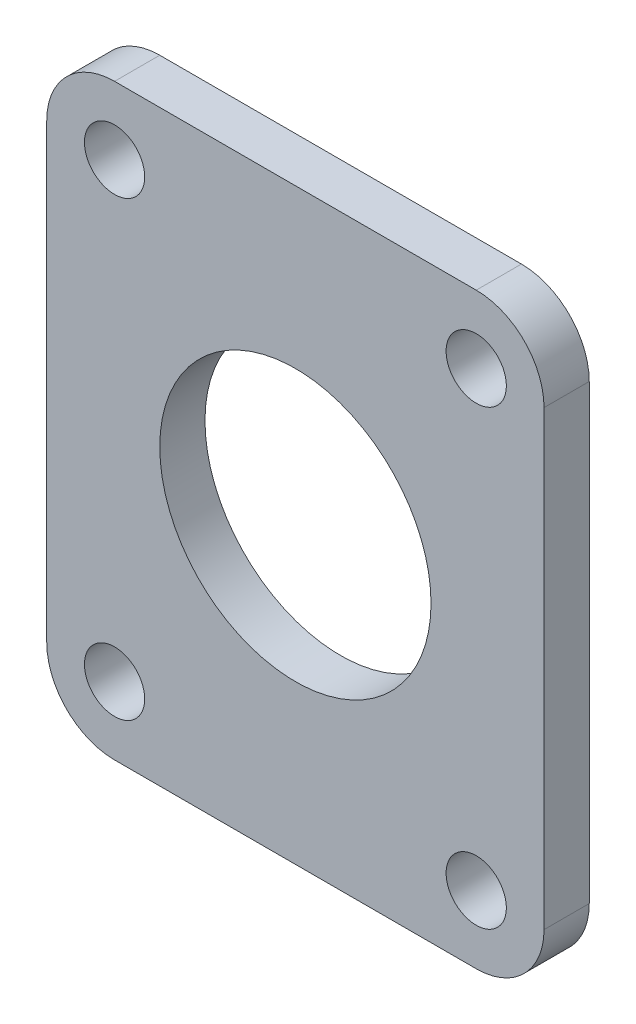
ISO-10303-21;
HEADER;
FILE_DESCRIPTION(('STEP AP214'),'2;1');
FILE_NAME('part.step','',(''),(''),'','','');
FILE_SCHEMA(('AUTOMOTIVE_DESIGN { 1 0 10303 214 1 1 1 1 }'));
ENDSEC;
DATA;
#1=APPLICATION_CONTEXT('core data for automotive mechanical design processes');
#2=APPLICATION_PROTOCOL_DEFINITION('international standard','automotive_design',2000,#1);
#3=PRODUCT_CONTEXT('',#1,'mechanical');
#4=PRODUCT('Part','Part','',(#3));
#5=PRODUCT_RELATED_PRODUCT_CATEGORY('part','',(#4));
#6=PRODUCT_DEFINITION_FORMATION('','',#4);
#7=PRODUCT_DEFINITION_CONTEXT('part definition',#1,'design');
#8=PRODUCT_DEFINITION('design','',#6,#7);
#9=PRODUCT_DEFINITION_SHAPE('','',#8);
#10=(LENGTH_UNIT() NAMED_UNIT(*) SI_UNIT(.MILLI.,.METRE.));
#11=(NAMED_UNIT(*) PLANE_ANGLE_UNIT() SI_UNIT($,.RADIAN.));
#12=(NAMED_UNIT(*) SI_UNIT($,.STERADIAN.) SOLID_ANGLE_UNIT());
#13=UNCERTAINTY_MEASURE_WITH_UNIT(LENGTH_MEASURE(1.E-05),#10,'distance_accuracy_value','');
#14=(GEOMETRIC_REPRESENTATION_CONTEXT(3) GLOBAL_UNCERTAINTY_ASSIGNED_CONTEXT((#13)) GLOBAL_UNIT_ASSIGNED_CONTEXT((#10,
#11,#12)) REPRESENTATION_CONTEXT('',''));
#15=CARTESIAN_POINT('',(0.,0.,0.));
#16=DIRECTION('',(0.,0.,1.));
#17=DIRECTION('',(1.,0.,0.));
#18=AXIS2_PLACEMENT_3D('',#15,#16,#17);
#19=CARTESIAN_POINT('',(653.3709893686,460.456018304,3.));
#20=DIRECTION('',(0.,0.,1.));
#21=DIRECTION('',(1.,0.,0.));
#22=AXIS2_PLACEMENT_3D('',#19,#20,#21);
#23=PLANE('',#22);
#24=CARTESIAN_POINT('',(653.3709893686,430.456018304,3.));
#25=DIRECTION('',(0.,0.,1.));
#26=DIRECTION('',(1.,0.,0.));
#27=AXIS2_PLACEMENT_3D('',#24,#25,#26);
#28=CIRCLE('',#27,2.);
#29=CARTESIAN_POINT('',(655.3709893686,430.456018304,3.));
#30=VERTEX_POINT('',#29);
#31=EDGE_CURVE('E194',#30,#30,#28,.T.);
#32=ORIENTED_EDGE('',*,*,#31,.F.);
#33=EDGE_LOOP('',(#32));
#34=FACE_BOUND('',#33,.T.);
#35=CARTESIAN_POINT('',(677.3709893686,460.456018304,3.));
#36=DIRECTION('',(0.,0.,1.));
#37=DIRECTION('',(1.,0.,0.));
#38=AXIS2_PLACEMENT_3D('',#35,#36,#37);
#39=CIRCLE('',#38,2.);
#40=CARTESIAN_POINT('',(679.3709893686,460.456018304,3.));
#41=VERTEX_POINT('',#40);
#42=EDGE_CURVE('E182',#41,#41,#39,.T.);
#43=ORIENTED_EDGE('',*,*,#42,.F.);
#44=EDGE_LOOP('',(#43));
#45=FACE_BOUND('',#44,.T.);
#46=CARTESIAN_POINT('',(653.3709893686,460.456018304,3.));
#47=DIRECTION('',(0.,0.,1.));
#48=DIRECTION('',(1.,0.,0.));
#49=AXIS2_PLACEMENT_3D('',#46,#47,#48);
#50=CIRCLE('',#49,4.50000000000003);
#51=CARTESIAN_POINT('',(653.3709893686,464.956018304,3.));
#52=VERTEX_POINT('',#51);
#53=CARTESIAN_POINT('',(648.8709893686,460.456018304,3.));
#54=VERTEX_POINT('',#53);
#55=EDGE_CURVE('E145',#52,#54,#50,.T.);
#56=ORIENTED_EDGE('',*,*,#55,.T.);
#57=DIRECTION('',(0.,-1.,0.));
#58=VECTOR('',#57,1.);
#59=CARTESIAN_POINT('',(648.8709893686,460.456018304,3.));
#60=LINE('',#59,#58);
#61=CARTESIAN_POINT('',(648.8709893686,430.456018304,3.));
#62=VERTEX_POINT('',#61);
#63=EDGE_CURVE('E93',#54,#62,#60,.T.);
#64=ORIENTED_EDGE('',*,*,#63,.T.);
#65=CARTESIAN_POINT('',(653.3709893686,430.456018304,3.));
#66=DIRECTION('',(0.,0.,1.));
#67=DIRECTION('',(1.,0.,0.));
#68=AXIS2_PLACEMENT_3D('',#65,#66,#67);
#69=CIRCLE('',#68,4.50000000000003);
#70=CARTESIAN_POINT('',(653.3709893686,425.956018304,3.));
#71=VERTEX_POINT('',#70);
#72=EDGE_CURVE('E160',#62,#71,#69,.T.);
#73=ORIENTED_EDGE('',*,*,#72,.T.);
#74=DIRECTION('',(1.,0.,0.));
#75=VECTOR('',#74,1.);
#76=CARTESIAN_POINT('',(653.3709893686,425.956018304,3.));
#77=LINE('',#76,#75);
#78=CARTESIAN_POINT('',(677.3709893686,425.956018304,3.));
#79=VERTEX_POINT('',#78);
#80=EDGE_CURVE('E173',#71,#79,#77,.T.);
#81=ORIENTED_EDGE('',*,*,#80,.T.);
#82=CARTESIAN_POINT('',(677.3709893686,430.456018304,3.));
#83=DIRECTION('',(0.,0.,1.));
#84=DIRECTION('',(1.,0.,0.));
#85=AXIS2_PLACEMENT_3D('',#82,#83,#84);
#86=CIRCLE('',#85,4.49999999999998);
#87=CARTESIAN_POINT('',(681.8709893686,430.456018304,3.));
#88=VERTEX_POINT('',#87);
#89=EDGE_CURVE('E112',#79,#88,#86,.T.);
#90=ORIENTED_EDGE('',*,*,#89,.T.);
#91=DIRECTION('',(0.,1.,0.));
#92=VECTOR('',#91,1.);
#93=CARTESIAN_POINT('',(681.8709893686,430.456018304,3.));
#94=LINE('',#93,#92);
#95=CARTESIAN_POINT('',(681.8709893686,460.456018304,3.));
#96=VERTEX_POINT('',#95);
#97=EDGE_CURVE('E106',#88,#96,#94,.T.);
#98=ORIENTED_EDGE('',*,*,#97,.T.);
#99=CARTESIAN_POINT('',(677.3709893686,460.456018304,3.));
#100=DIRECTION('',(0.,0.,1.));
#101=DIRECTION('',(1.,0.,0.));
#102=AXIS2_PLACEMENT_3D('',#99,#100,#101);
#103=CIRCLE('',#102,4.49999999999998);
#104=CARTESIAN_POINT('',(677.3709893686,464.956018304,3.));
#105=VERTEX_POINT('',#104);
#106=EDGE_CURVE('E110',#96,#105,#103,.T.);
#107=ORIENTED_EDGE('',*,*,#106,.T.);
#108=DIRECTION('',(-1.,0.,0.));
#109=VECTOR('',#108,1.);
#110=CARTESIAN_POINT('',(677.3709893686,464.956018304,3.));
#111=LINE('',#110,#109);
#112=EDGE_CURVE('E50',#105,#52,#111,.T.);
#113=ORIENTED_EDGE('',*,*,#112,.T.);
#114=EDGE_LOOP('',(#56,#64,#73,#81,#90,#98,#107,#113));
#115=FACE_BOUND('',#114,.T.);
#116=CARTESIAN_POINT('',(677.3709893686,430.456018304,3.));
#117=DIRECTION('',(0.,0.,1.));
#118=DIRECTION('',(1.,0.,0.));
#119=AXIS2_PLACEMENT_3D('',#116,#117,#118);
#120=CIRCLE('',#119,2.);
#121=CARTESIAN_POINT('',(679.3709893686,430.456018304,3.));
#122=VERTEX_POINT('',#121);
#123=EDGE_CURVE('E134',#122,#122,#120,.T.);
#124=ORIENTED_EDGE('',*,*,#123,.F.);
#125=EDGE_LOOP('',(#124));
#126=FACE_BOUND('',#125,.T.);
#127=CARTESIAN_POINT('',(653.3709893686,460.456018304,3.));
#128=DIRECTION('',(0.,0.,1.));
#129=DIRECTION('',(1.,0.,0.));
#130=AXIS2_PLACEMENT_3D('',#127,#128,#129);
#131=CIRCLE('',#130,2.);
#132=CARTESIAN_POINT('',(655.3709893686,460.456018304,3.));
#133=VERTEX_POINT('',#132);
#134=EDGE_CURVE('E188',#133,#133,#131,.T.);
#135=ORIENTED_EDGE('',*,*,#134,.F.);
#136=EDGE_LOOP('',(#135));
#137=FACE_BOUND('',#136,.T.);
#138=CARTESIAN_POINT('',(665.3709893686,445.456018304,3.));
#139=DIRECTION('',(0.,0.,1.));
#140=DIRECTION('',(1.,0.,0.));
#141=AXIS2_PLACEMENT_3D('',#138,#139,#140);
#142=CIRCLE('',#141,9.00000000000001);
#143=CARTESIAN_POINT('',(674.3709893686,445.456018304,3.));
#144=VERTEX_POINT('',#143);
#145=EDGE_CURVE('E200',#144,#144,#142,.T.);
#146=ORIENTED_EDGE('',*,*,#145,.F.);
#147=EDGE_LOOP('',(#146));
#148=FACE_BOUND('',#147,.T.);
#149=ADVANCED_FACE('F33',(#34,#45,#115,#126,#137,#148),#23,.T.);
#150=CARTESIAN_POINT('',(653.3709893686,460.456018304,0.));
#151=DIRECTION('',(0.,0.,1.));
#152=DIRECTION('',(1.,0.,0.));
#153=AXIS2_PLACEMENT_3D('',#150,#151,#152);
#154=PLANE('',#153);
#155=CARTESIAN_POINT('',(653.3709893686,430.456018304,0.));
#156=DIRECTION('',(0.,0.,1.));
#157=DIRECTION('',(1.,0.,0.));
#158=AXIS2_PLACEMENT_3D('',#155,#156,#157);
#159=CIRCLE('',#158,2.);
#160=CARTESIAN_POINT('',(655.3709893686,430.456018304,0.));
#161=VERTEX_POINT('',#160);
#162=EDGE_CURVE('E197',#161,#161,#159,.T.);
#163=ORIENTED_EDGE('',*,*,#162,.T.);
#164=EDGE_LOOP('',(#163));
#165=FACE_BOUND('',#164,.T.);
#166=CARTESIAN_POINT('',(677.3709893686,460.456018304,0.));
#167=DIRECTION('',(0.,0.,1.));
#168=DIRECTION('',(1.,0.,0.));
#169=AXIS2_PLACEMENT_3D('',#166,#167,#168);
#170=CIRCLE('',#169,2.);
#171=CARTESIAN_POINT('',(679.3709893686,460.456018304,0.));
#172=VERTEX_POINT('',#171);
#173=EDGE_CURVE('E185',#172,#172,#170,.T.);
#174=ORIENTED_EDGE('',*,*,#173,.T.);
#175=EDGE_LOOP('',(#174));
#176=FACE_BOUND('',#175,.T.);
#177=CARTESIAN_POINT('',(653.3709893686,460.456018304,0.));
#178=DIRECTION('',(0.,0.,1.));
#179=DIRECTION('',(1.,0.,0.));
#180=AXIS2_PLACEMENT_3D('',#177,#178,#179);
#181=CIRCLE('',#180,4.50000000000003);
#182=CARTESIAN_POINT('',(653.3709893686,464.956018304,0.));
#183=VERTEX_POINT('',#182);
#184=CARTESIAN_POINT('',(648.8709893686,460.456018304,0.));
#185=VERTEX_POINT('',#184);
#186=EDGE_CURVE('E130',#183,#185,#181,.T.);
#187=ORIENTED_EDGE('',*,*,#186,.F.);
#188=DIRECTION('',(-1.,0.,0.));
#189=VECTOR('',#188,1.);
#190=CARTESIAN_POINT('',(677.3709893686,464.956018304,0.));
#191=LINE('',#190,#189);
#192=CARTESIAN_POINT('',(677.3709893686,464.956018304,0.));
#193=VERTEX_POINT('',#192);
#194=EDGE_CURVE('E85',#193,#183,#191,.T.);
#195=ORIENTED_EDGE('',*,*,#194,.F.);
#196=CARTESIAN_POINT('',(677.3709893686,460.456018304,0.));
#197=DIRECTION('',(0.,0.,1.));
#198=DIRECTION('',(1.,0.,0.));
#199=AXIS2_PLACEMENT_3D('',#196,#197,#198);
#200=CIRCLE('',#199,4.49999999999998);
#201=CARTESIAN_POINT('',(681.8709893686,460.456018304,0.));
#202=VERTEX_POINT('',#201);
#203=EDGE_CURVE('E79',#202,#193,#200,.T.);
#204=ORIENTED_EDGE('',*,*,#203,.F.);
#205=DIRECTION('',(0.,1.,0.));
#206=VECTOR('',#205,1.);
#207=CARTESIAN_POINT('',(681.8709893686,430.456018304,0.));
#208=LINE('',#207,#206);
#209=CARTESIAN_POINT('',(681.8709893686,430.456018304,0.));
#210=VERTEX_POINT('',#209);
#211=EDGE_CURVE('E120',#210,#202,#208,.T.);
#212=ORIENTED_EDGE('',*,*,#211,.F.);
#213=CARTESIAN_POINT('',(677.3709893686,430.456018304,0.));
#214=DIRECTION('',(0.,0.,1.));
#215=DIRECTION('',(1.,0.,0.));
#216=AXIS2_PLACEMENT_3D('',#213,#214,#215);
#217=CIRCLE('',#216,4.49999999999998);
#218=CARTESIAN_POINT('',(677.3709893686,425.956018304,0.));
#219=VERTEX_POINT('',#218);
#220=EDGE_CURVE('E140',#219,#210,#217,.T.);
#221=ORIENTED_EDGE('',*,*,#220,.F.);
#222=DIRECTION('',(1.,0.,0.));
#223=VECTOR('',#222,1.);
#224=CARTESIAN_POINT('',(653.3709893686,425.956018304,0.));
#225=LINE('',#224,#223);
#226=CARTESIAN_POINT('',(653.3709893686,425.956018304,0.));
#227=VERTEX_POINT('',#226);
#228=EDGE_CURVE('E138',#227,#219,#225,.T.);
#229=ORIENTED_EDGE('',*,*,#228,.F.);
#230=CARTESIAN_POINT('',(653.3709893686,430.456018304,0.));
#231=DIRECTION('',(0.,0.,1.));
#232=DIRECTION('',(1.,0.,0.));
#233=AXIS2_PLACEMENT_3D('',#230,#231,#232);
#234=CIRCLE('',#233,4.50000000000003);
#235=CARTESIAN_POINT('',(648.8709893686,430.456018304,0.));
#236=VERTEX_POINT('',#235);
#237=EDGE_CURVE('E136',#236,#227,#234,.T.);
#238=ORIENTED_EDGE('',*,*,#237,.F.);
#239=DIRECTION('',(0.,-1.,0.));
#240=VECTOR('',#239,1.);
#241=CARTESIAN_POINT('',(648.8709893686,460.456018304,0.));
#242=LINE('',#241,#240);
#243=EDGE_CURVE('E133',#185,#236,#242,.T.);
#244=ORIENTED_EDGE('',*,*,#243,.F.);
#245=EDGE_LOOP('',(#187,#195,#204,#212,#221,#229,#238,#244));
#246=FACE_BOUND('',#245,.T.);
#247=CARTESIAN_POINT('',(677.3709893686,430.456018304,0.));
#248=DIRECTION('',(0.,0.,1.));
#249=DIRECTION('',(1.,0.,0.));
#250=AXIS2_PLACEMENT_3D('',#247,#248,#249);
#251=CIRCLE('',#250,2.);
#252=CARTESIAN_POINT('',(679.3709893686,430.456018304,0.));
#253=VERTEX_POINT('',#252);
#254=EDGE_CURVE('E179',#253,#253,#251,.T.);
#255=ORIENTED_EDGE('',*,*,#254,.T.);
#256=EDGE_LOOP('',(#255));
#257=FACE_BOUND('',#256,.T.);
#258=CARTESIAN_POINT('',(653.3709893686,460.456018304,0.));
#259=DIRECTION('',(0.,0.,1.));
#260=DIRECTION('',(1.,0.,0.));
#261=AXIS2_PLACEMENT_3D('',#258,#259,#260);
#262=CIRCLE('',#261,2.);
#263=CARTESIAN_POINT('',(655.3709893686,460.456018304,0.));
#264=VERTEX_POINT('',#263);
#265=EDGE_CURVE('E191',#264,#264,#262,.T.);
#266=ORIENTED_EDGE('',*,*,#265,.T.);
#267=EDGE_LOOP('',(#266));
#268=FACE_BOUND('',#267,.T.);
#269=CARTESIAN_POINT('',(665.3709893686,445.456018304,0.));
#270=DIRECTION('',(0.,0.,1.));
#271=DIRECTION('',(1.,0.,0.));
#272=AXIS2_PLACEMENT_3D('',#269,#270,#271);
#273=CIRCLE('',#272,9.00000000000001);
#274=CARTESIAN_POINT('',(674.3709893686,445.456018304,0.));
#275=VERTEX_POINT('',#274);
#276=EDGE_CURVE('E203',#275,#275,#273,.T.);
#277=ORIENTED_EDGE('',*,*,#276,.T.);
#278=EDGE_LOOP('',(#277));
#279=FACE_BOUND('',#278,.T.);
#280=ADVANCED_FACE('F164',(#165,#176,#246,#257,#268,#279),#154,.F.);
#281=CARTESIAN_POINT('',(653.3709893686,460.456018304,3.));
#282=DIRECTION('',(0.,0.,-1.));
#283=DIRECTION('',(-1.,0.,0.));
#284=AXIS2_PLACEMENT_3D('',#281,#282,#283);
#285=CYLINDRICAL_SURFACE('',#284,4.50000000000003);
#286=ORIENTED_EDGE('',*,*,#186,.T.);
#287=DIRECTION('',(0.,0.,-1.));
#288=VECTOR('',#287,1.);
#289=CARTESIAN_POINT('',(648.8709893686,460.456018304,3.));
#290=LINE('',#289,#288);
#291=EDGE_CURVE('E11',#54,#185,#290,.T.);
#292=ORIENTED_EDGE('',*,*,#291,.F.);
#293=ORIENTED_EDGE('',*,*,#55,.F.);
#294=DIRECTION('',(0.,0.,-1.));
#295=VECTOR('',#294,1.);
#296=CARTESIAN_POINT('',(653.3709893686,464.956018304,3.));
#297=LINE('',#296,#295);
#298=EDGE_CURVE('E126',#52,#183,#297,.T.);
#299=ORIENTED_EDGE('',*,*,#298,.T.);
#300=EDGE_LOOP('',(#286,#292,#293,#299));
#301=FACE_BOUND('',#300,.T.);
#302=ADVANCED_FACE('F35',(#301),#285,.T.);
#303=CARTESIAN_POINT('',(648.8709893686,460.456018304,3.));
#304=DIRECTION('',(1.,0.,0.));
#305=DIRECTION('',(0.,0.,-1.));
#306=AXIS2_PLACEMENT_3D('',#303,#304,#305);
#307=PLANE('',#306);
#308=ORIENTED_EDGE('',*,*,#243,.T.);
#309=DIRECTION('',(0.,0.,-1.));
#310=VECTOR('',#309,1.);
#311=CARTESIAN_POINT('',(648.8709893686,430.456018304,3.));
#312=LINE('',#311,#310);
#313=EDGE_CURVE('E42',#62,#236,#312,.T.);
#314=ORIENTED_EDGE('',*,*,#313,.F.);
#315=ORIENTED_EDGE('',*,*,#63,.F.);
#316=ORIENTED_EDGE('',*,*,#291,.T.);
#317=EDGE_LOOP('',(#308,#314,#315,#316));
#318=FACE_BOUND('',#317,.T.);
#319=ADVANCED_FACE('F238',(#318),#307,.F.);
#320=CARTESIAN_POINT('',(653.3709893686,430.456018304,3.));
#321=DIRECTION('',(0.,0.,-1.));
#322=DIRECTION('',(-1.,0.,0.));
#323=AXIS2_PLACEMENT_3D('',#320,#321,#322);
#324=CYLINDRICAL_SURFACE('',#323,4.50000000000003);
#325=ORIENTED_EDGE('',*,*,#237,.T.);
#326=DIRECTION('',(0.,0.,-1.));
#327=VECTOR('',#326,1.);
#328=CARTESIAN_POINT('',(653.3709893686,425.956018304,3.));
#329=LINE('',#328,#327);
#330=EDGE_CURVE('E152',#71,#227,#329,.T.);
#331=ORIENTED_EDGE('',*,*,#330,.F.);
#332=ORIENTED_EDGE('',*,*,#72,.F.);
#333=ORIENTED_EDGE('',*,*,#313,.T.);
#334=EDGE_LOOP('',(#325,#331,#332,#333));
#335=FACE_BOUND('',#334,.T.);
#336=ADVANCED_FACE('F158',(#335),#324,.T.);
#337=CARTESIAN_POINT('',(653.3709893686,425.956018304,3.));
#338=DIRECTION('',(0.,1.,0.));
#339=DIRECTION('',(0.,0.,1.));
#340=AXIS2_PLACEMENT_3D('',#337,#338,#339);
#341=PLANE('',#340);
#342=ORIENTED_EDGE('',*,*,#228,.T.);
#343=DIRECTION('',(0.,0.,-1.));
#344=VECTOR('',#343,1.);
#345=CARTESIAN_POINT('',(677.3709893686,425.956018304,3.));
#346=LINE('',#345,#344);
#347=EDGE_CURVE('E149',#79,#219,#346,.T.);
#348=ORIENTED_EDGE('',*,*,#347,.F.);
#349=ORIENTED_EDGE('',*,*,#80,.F.);
#350=ORIENTED_EDGE('',*,*,#330,.T.);
#351=EDGE_LOOP('',(#342,#348,#349,#350));
#352=FACE_BOUND('',#351,.T.);
#353=ADVANCED_FACE('F169',(#352),#341,.F.);
#354=CARTESIAN_POINT('',(677.3709893686,430.456018304,3.));
#355=DIRECTION('',(0.,0.,-1.));
#356=DIRECTION('',(-1.,0.,0.));
#357=AXIS2_PLACEMENT_3D('',#354,#355,#356);
#358=CYLINDRICAL_SURFACE('',#357,4.49999999999998);
#359=ORIENTED_EDGE('',*,*,#220,.T.);
#360=DIRECTION('',(0.,0.,-1.));
#361=VECTOR('',#360,1.);
#362=CARTESIAN_POINT('',(681.8709893686,430.456018304,3.));
#363=LINE('',#362,#361);
#364=EDGE_CURVE('E121',#88,#210,#363,.T.);
#365=ORIENTED_EDGE('',*,*,#364,.F.);
#366=ORIENTED_EDGE('',*,*,#89,.F.);
#367=ORIENTED_EDGE('',*,*,#347,.T.);
#368=EDGE_LOOP('',(#359,#365,#366,#367));
#369=FACE_BOUND('',#368,.T.);
#370=ADVANCED_FACE('F172',(#369),#358,.T.);
#371=CARTESIAN_POINT('',(681.8709893686,430.456018304,3.));
#372=DIRECTION('',(-1.,0.,0.));
#373=DIRECTION('',(0.,0.,1.));
#374=AXIS2_PLACEMENT_3D('',#371,#372,#373);
#375=PLANE('',#374);
#376=ORIENTED_EDGE('',*,*,#211,.T.);
#377=DIRECTION('',(0.,0.,-1.));
#378=VECTOR('',#377,1.);
#379=CARTESIAN_POINT('',(681.8709893686,460.456018304,3.));
#380=LINE('',#379,#378);
#381=EDGE_CURVE('E117',#96,#202,#380,.T.);
#382=ORIENTED_EDGE('',*,*,#381,.F.);
#383=ORIENTED_EDGE('',*,*,#97,.F.);
#384=ORIENTED_EDGE('',*,*,#364,.T.);
#385=EDGE_LOOP('',(#376,#382,#383,#384));
#386=FACE_BOUND('',#385,.T.);
#387=ADVANCED_FACE('F118',(#386),#375,.F.);
#388=CARTESIAN_POINT('',(677.3709893686,460.456018304,3.));
#389=DIRECTION('',(0.,0.,-1.));
#390=DIRECTION('',(-1.,0.,0.));
#391=AXIS2_PLACEMENT_3D('',#388,#389,#390);
#392=CYLINDRICAL_SURFACE('',#391,4.49999999999998);
#393=ORIENTED_EDGE('',*,*,#203,.T.);
#394=DIRECTION('',(0.,0.,-1.));
#395=VECTOR('',#394,1.);
#396=CARTESIAN_POINT('',(677.3709893686,464.956018304,3.));
#397=LINE('',#396,#395);
#398=EDGE_CURVE('E122',#105,#193,#397,.T.);
#399=ORIENTED_EDGE('',*,*,#398,.F.);
#400=ORIENTED_EDGE('',*,*,#106,.F.);
#401=ORIENTED_EDGE('',*,*,#381,.T.);
#402=EDGE_LOOP('',(#393,#399,#400,#401));
#403=FACE_BOUND('',#402,.T.);
#404=ADVANCED_FACE('F124',(#403),#392,.T.);
#405=CARTESIAN_POINT('',(677.3709893686,464.956018304,3.));
#406=DIRECTION('',(0.,-1.,0.));
#407=DIRECTION('',(0.,0.,-1.));
#408=AXIS2_PLACEMENT_3D('',#405,#406,#407);
#409=PLANE('',#408);
#410=ORIENTED_EDGE('',*,*,#194,.T.);
#411=ORIENTED_EDGE('',*,*,#298,.F.);
#412=ORIENTED_EDGE('',*,*,#112,.F.);
#413=ORIENTED_EDGE('',*,*,#398,.T.);
#414=EDGE_LOOP('',(#410,#411,#412,#413));
#415=FACE_BOUND('',#414,.T.);
#416=ADVANCED_FACE('F226',(#415),#409,.F.);
#417=CARTESIAN_POINT('',(677.3709893686,430.456018304,3.));
#418=DIRECTION('',(0.,0.,-1.));
#419=DIRECTION('',(-1.,0.,0.));
#420=AXIS2_PLACEMENT_3D('',#417,#418,#419);
#421=CYLINDRICAL_SURFACE('',#420,2.);
#422=ORIENTED_EDGE('',*,*,#123,.T.);
#423=EDGE_LOOP('',(#422));
#424=FACE_BOUND('',#423,.T.);
#425=ORIENTED_EDGE('',*,*,#254,.F.);
#426=EDGE_LOOP('',(#425));
#427=FACE_BOUND('',#426,.T.);
#428=ADVANCED_FACE('F223',(#424,#427),#421,.F.);
#429=CARTESIAN_POINT('',(677.3709893686,460.456018304,3.));
#430=DIRECTION('',(0.,0.,-1.));
#431=DIRECTION('',(-1.,0.,0.));
#432=AXIS2_PLACEMENT_3D('',#429,#430,#431);
#433=CYLINDRICAL_SURFACE('',#432,2.);
#434=ORIENTED_EDGE('',*,*,#42,.T.);
#435=EDGE_LOOP('',(#434));
#436=FACE_BOUND('',#435,.T.);
#437=ORIENTED_EDGE('',*,*,#173,.F.);
#438=EDGE_LOOP('',(#437));
#439=FACE_BOUND('',#438,.T.);
#440=ADVANCED_FACE('F302',(#436,#439),#433,.F.);
#441=CARTESIAN_POINT('',(653.3709893686,460.456018304,3.));
#442=DIRECTION('',(0.,0.,-1.));
#443=DIRECTION('',(-1.,0.,0.));
#444=AXIS2_PLACEMENT_3D('',#441,#442,#443);
#445=CYLINDRICAL_SURFACE('',#444,2.);
#446=ORIENTED_EDGE('',*,*,#134,.T.);
#447=EDGE_LOOP('',(#446));
#448=FACE_BOUND('',#447,.T.);
#449=ORIENTED_EDGE('',*,*,#265,.F.);
#450=EDGE_LOOP('',(#449));
#451=FACE_BOUND('',#450,.T.);
#452=ADVANCED_FACE('F310',(#448,#451),#445,.F.);
#453=CARTESIAN_POINT('',(653.3709893686,430.456018304,3.));
#454=DIRECTION('',(0.,0.,-1.));
#455=DIRECTION('',(-1.,0.,0.));
#456=AXIS2_PLACEMENT_3D('',#453,#454,#455);
#457=CYLINDRICAL_SURFACE('',#456,2.);
#458=ORIENTED_EDGE('',*,*,#31,.T.);
#459=EDGE_LOOP('',(#458));
#460=FACE_BOUND('',#459,.T.);
#461=ORIENTED_EDGE('',*,*,#162,.F.);
#462=EDGE_LOOP('',(#461));
#463=FACE_BOUND('',#462,.T.);
#464=ADVANCED_FACE('F318',(#460,#463),#457,.F.);
#465=CARTESIAN_POINT('',(665.3709893686,445.456018304,3.));
#466=DIRECTION('',(0.,0.,-1.));
#467=DIRECTION('',(-1.,0.,0.));
#468=AXIS2_PLACEMENT_3D('',#465,#466,#467);
#469=CYLINDRICAL_SURFACE('',#468,9.00000000000001);
#470=ORIENTED_EDGE('',*,*,#145,.T.);
#471=EDGE_LOOP('',(#470));
#472=FACE_BOUND('',#471,.T.);
#473=ORIENTED_EDGE('',*,*,#276,.F.);
#474=EDGE_LOOP('',(#473));
#475=FACE_BOUND('',#474,.T.);
#476=ADVANCED_FACE('F209',(#472,#475),#469,.F.);
#477=CLOSED_SHELL('',(#149,#280,#302,#319,#336,#353,#370,#387,#404,#416,#428,#440,#452,#464,#476));
#478=MANIFOLD_SOLID_BREP('B2',#477);
#479=ADVANCED_BREP_SHAPE_REPRESENTATION('',(#18,#478),#14);
#480=SHAPE_DEFINITION_REPRESENTATION(#9,#479);
ENDSEC;
END-ISO-10303-21;
